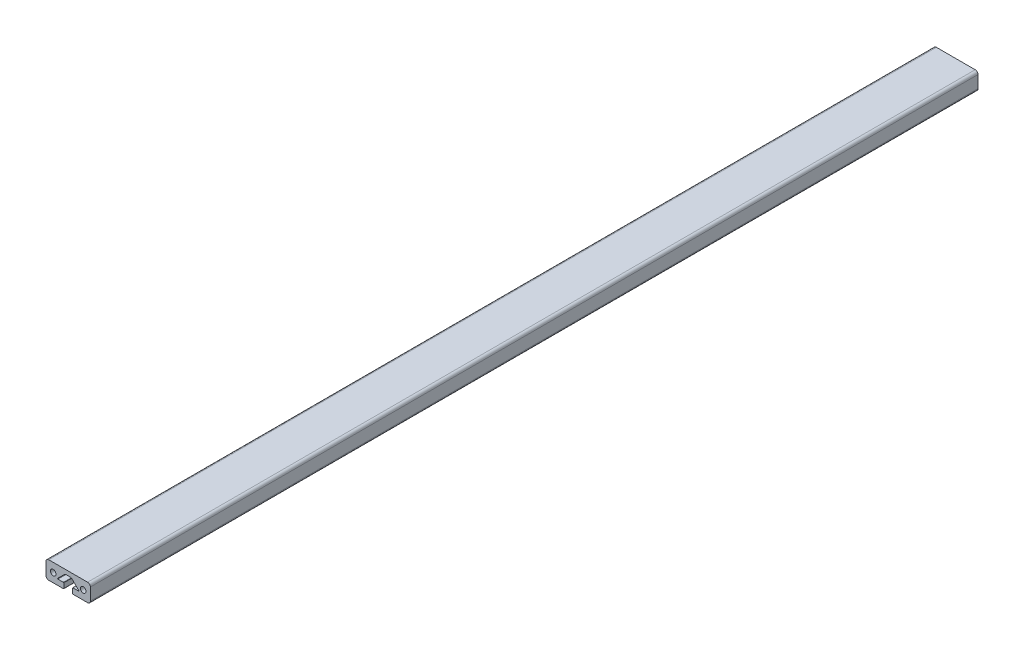
ISO-10303-21;
HEADER;
FILE_DESCRIPTION(('STEP AP214'),'2;1');
FILE_NAME('part.step','',(''),(''),'','','');
FILE_SCHEMA(('AUTOMOTIVE_DESIGN { 1 0 10303 214 1 1 1 1 }'));
ENDSEC;
DATA;
#1=APPLICATION_CONTEXT('core data for automotive mechanical design processes');
#2=APPLICATION_PROTOCOL_DEFINITION('international standard','automotive_design',2000,#1);
#3=PRODUCT_CONTEXT('',#1,'mechanical');
#4=PRODUCT('Part','Part','',(#3));
#5=PRODUCT_RELATED_PRODUCT_CATEGORY('part','',(#4));
#6=PRODUCT_DEFINITION_FORMATION('','',#4);
#7=PRODUCT_DEFINITION_CONTEXT('part definition',#1,'design');
#8=PRODUCT_DEFINITION('design','',#6,#7);
#9=PRODUCT_DEFINITION_SHAPE('','',#8);
#10=(LENGTH_UNIT() NAMED_UNIT(*) SI_UNIT(.MILLI.,.METRE.));
#11=(NAMED_UNIT(*) PLANE_ANGLE_UNIT() SI_UNIT($,.RADIAN.));
#12=(NAMED_UNIT(*) SI_UNIT($,.STERADIAN.) SOLID_ANGLE_UNIT());
#13=UNCERTAINTY_MEASURE_WITH_UNIT(LENGTH_MEASURE(1.E-05),#10,'distance_accuracy_value','');
#14=(GEOMETRIC_REPRESENTATION_CONTEXT(3) GLOBAL_UNCERTAINTY_ASSIGNED_CONTEXT((#13)) GLOBAL_UNIT_ASSIGNED_CONTEXT((#10,
#11,#12)) REPRESENTATION_CONTEXT('',''));
#15=CARTESIAN_POINT('',(0.,0.,0.));
#16=DIRECTION('',(0.,0.,1.));
#17=DIRECTION('',(1.,0.,0.));
#18=AXIS2_PLACEMENT_3D('',#15,#16,#17);
#19=CARTESIAN_POINT('',(-1.09175820488421,1.74579242636731,800.));
#20=DIRECTION('',(0.,0.,1.));
#21=DIRECTION('',(1.,0.,0.));
#22=AXIS2_PLACEMENT_3D('',#19,#20,#21);
#23=PLANE('',#22);
#24=CARTESIAN_POINT('',(-12.6201853296306,-0.45420757363257,800.));
#25=DIRECTION('',(0.,0.,1.));
#26=DIRECTION('',(1.,0.,0.));
#27=AXIS2_PLACEMENT_3D('',#24,#25,#26);
#28=CIRCLE('',#27,2.49999999999995);
#29=CARTESIAN_POINT('',(-10.1201853296307,-0.45420757363257,800.));
#30=VERTEX_POINT('',#29);
#31=EDGE_CURVE('E228',#30,#30,#28,.T.);
#32=ORIENTED_EDGE('',*,*,#31,.F.);
#33=EDGE_LOOP('',(#32));
#34=FACE_BOUND('',#33,.T.);
#35=CARTESIAN_POINT('',(-1.09175820488421,1.74579242636731,800.));
#36=DIRECTION('',(0.,0.,-1.));
#37=DIRECTION('',(1.,0.,0.));
#38=AXIS2_PLACEMENT_3D('',#35,#36,#37);
#39=CIRCLE('',#38,1.99999999999981);
#40=CARTESIAN_POINT('',(-2.50597176725728,3.16000598874015,800.));
#41=VERTEX_POINT('',#40);
#42=CARTESIAN_POINT('',(-1.09175820488421,3.74579242636711,800.));
#43=VERTEX_POINT('',#42);
#44=EDGE_CURVE('E271',#41,#43,#39,.T.);
#45=ORIENTED_EDGE('',*,*,#44,.T.);
#46=DIRECTION('',(1.,0.,0.));
#47=VECTOR('',#46,1.);
#48=CARTESIAN_POINT('',(-1.09175820488421,3.74579242636711,800.));
#49=LINE('',#48,#47);
#50=CARTESIAN_POINT('',(2.8513875456237,3.74579242636711,800.));
#51=VERTEX_POINT('',#50);
#52=EDGE_CURVE('E139',#43,#51,#49,.T.);
#53=ORIENTED_EDGE('',*,*,#52,.T.);
#54=CARTESIAN_POINT('',(2.85138754562348,1.7457924263674,800.));
#55=DIRECTION('',(0.,0.,-1.));
#56=DIRECTION('',(1.,0.,0.));
#57=AXIS2_PLACEMENT_3D('',#54,#55,#56);
#58=CIRCLE('',#57,1.99999999999971);
#59=CARTESIAN_POINT('',(4.26560110799648,3.16000598874018,800.));
#60=VERTEX_POINT('',#59);
#61=EDGE_CURVE('E334',#51,#60,#58,.T.);
#62=ORIENTED_EDGE('',*,*,#61,.T.);
#63=DIRECTION('',(0.707106781186548,-0.707106781186548,0.));
#64=VECTOR('',#63,1.);
#65=CARTESIAN_POINT('',(4.26560110799648,3.16000598874018,800.));
#66=LINE('',#65,#64);
#67=CARTESIAN_POINT('',(10.3676826360141,-2.94207553927743,800.));
#68=VERTEX_POINT('',#67);
#69=EDGE_CURVE('E353',#60,#68,#66,.T.);
#70=ORIENTED_EDGE('',*,*,#69,.T.);
#71=CARTESIAN_POINT('',(10.1555506016582,-3.15420757363334,800.));
#72=DIRECTION('',(0.,0.,-1.));
#73=DIRECTION('',(1.,0.,0.));
#74=AXIS2_PLACEMENT_3D('',#71,#72,#73);
#75=CIRCLE('',#74,0.299999999999926);
#76=CARTESIAN_POINT('',(10.1555506016583,-3.45420757363327,800.));
#77=VERTEX_POINT('',#76);
#78=EDGE_CURVE('E350',#68,#77,#75,.T.);
#79=ORIENTED_EDGE('',*,*,#78,.T.);
#80=DIRECTION('',(-1.,0.,0.));
#81=VECTOR('',#80,1.);
#82=CARTESIAN_POINT('',(10.1555506016583,-3.45420757363327,800.));
#83=LINE('',#82,#81);
#84=CARTESIAN_POINT('',(5.17981467036988,-3.45420757363327,800.));
#85=VERTEX_POINT('',#84);
#86=EDGE_CURVE('E352',#77,#85,#83,.T.);
#87=ORIENTED_EDGE('',*,*,#86,.T.);
#88=CARTESIAN_POINT('',(5.17981467036977,-3.75420757363335,800.));
#89=DIRECTION('',(0.,0.,1.));
#90=DIRECTION('',(1.,0.,0.));
#91=AXIS2_PLACEMENT_3D('',#88,#89,#90);
#92=CIRCLE('',#91,0.300000000000078);
#93=CARTESIAN_POINT('',(4.87981467036969,-3.75420757363323,800.));
#94=VERTEX_POINT('',#93);
#95=EDGE_CURVE('E355',#85,#94,#92,.T.);
#96=ORIENTED_EDGE('',*,*,#95,.T.);
#97=DIRECTION('',(0.,-1.,0.));
#98=VECTOR('',#97,1.);
#99=CARTESIAN_POINT('',(4.87981467036969,-3.75420757363323,800.));
#100=LINE('',#99,#98);
#101=CARTESIAN_POINT('',(4.87981467036969,-8.1542075736333,800.));
#102=VERTEX_POINT('',#101);
#103=EDGE_CURVE('E361',#94,#102,#100,.T.);
#104=ORIENTED_EDGE('',*,*,#103,.T.);
#105=CARTESIAN_POINT('',(5.17981467036977,-8.15420757363319,800.));
#106=DIRECTION('',(0.,0.,1.));
#107=DIRECTION('',(1.,0.,0.));
#108=AXIS2_PLACEMENT_3D('',#105,#106,#107);
#109=CIRCLE('',#108,0.300000000000078);
#110=CARTESIAN_POINT('',(5.17981467036988,-8.45420757363327,800.));
#111=VERTEX_POINT('',#110);
#112=EDGE_CURVE('E363',#102,#111,#109,.T.);
#113=ORIENTED_EDGE('',*,*,#112,.T.);
#114=DIRECTION('',(1.,0.,0.));
#115=VECTOR('',#114,1.);
#116=CARTESIAN_POINT('',(5.17981467036988,-8.45420757363327,800.));
#117=LINE('',#116,#115);
#118=CARTESIAN_POINT('',(18.3798146703701,-8.45420757363327,800.));
#119=VERTEX_POINT('',#118);
#120=EDGE_CURVE('E365',#111,#119,#117,.T.);
#121=ORIENTED_EDGE('',*,*,#120,.T.);
#122=CARTESIAN_POINT('',(18.3798146703701,-5.95420757363321,800.));
#123=DIRECTION('',(0.,0.,1.));
#124=DIRECTION('',(1.,0.,0.));
#125=AXIS2_PLACEMENT_3D('',#122,#123,#124);
#126=CIRCLE('',#125,2.50000000000006);
#127=CARTESIAN_POINT('',(20.8798146703701,-5.95420757363332,800.));
#128=VERTEX_POINT('',#127);
#129=EDGE_CURVE('E367',#119,#128,#126,.T.);
#130=ORIENTED_EDGE('',*,*,#129,.T.);
#131=DIRECTION('',(0.,1.,0.));
#132=VECTOR('',#131,1.);
#133=CARTESIAN_POINT('',(20.8798146703701,-5.95420757363332,800.));
#134=LINE('',#133,#132);
#135=CARTESIAN_POINT('',(20.8798146703701,5.04579242636669,800.));
#136=VERTEX_POINT('',#135);
#137=EDGE_CURVE('E369',#128,#136,#134,.T.);
#138=ORIENTED_EDGE('',*,*,#137,.T.);
#139=CARTESIAN_POINT('',(18.3798146703701,5.04579242636735,800.));
#140=DIRECTION('',(0.,0.,1.));
#141=DIRECTION('',(1.,0.,0.));
#142=AXIS2_PLACEMENT_3D('',#139,#140,#141);
#143=CIRCLE('',#142,2.50000000000009);
#144=CARTESIAN_POINT('',(18.3798146703694,7.54579242636744,800.));
#145=VERTEX_POINT('',#144);
#146=EDGE_CURVE('E371',#136,#145,#143,.T.);
#147=ORIENTED_EDGE('',*,*,#146,.T.);
#148=DIRECTION('',(-1.,0.,0.));
#149=VECTOR('',#148,1.);
#150=CARTESIAN_POINT('',(18.3798146703694,7.54579242636744,800.));
#151=LINE('',#150,#149);
#152=CARTESIAN_POINT('',(-16.6201853296301,7.54579242636744,800.));
#153=VERTEX_POINT('',#152);
#154=EDGE_CURVE('E373',#145,#153,#151,.T.);
#155=ORIENTED_EDGE('',*,*,#154,.T.);
#156=CARTESIAN_POINT('',(-16.6201853296299,5.04579242636727,800.));
#157=DIRECTION('',(0.,0.,1.));
#158=DIRECTION('',(1.,0.,0.));
#159=AXIS2_PLACEMENT_3D('',#156,#157,#158);
#160=CIRCLE('',#159,2.50000000000017);
#161=CARTESIAN_POINT('',(-19.1201853296301,5.04579242636738,800.));
#162=VERTEX_POINT('',#161);
#163=EDGE_CURVE('E375',#153,#162,#160,.T.);
#164=ORIENTED_EDGE('',*,*,#163,.T.);
#165=DIRECTION('',(0.,-1.,0.));
#166=VECTOR('',#165,1.);
#167=CARTESIAN_POINT('',(-19.1201853296301,5.04579242636738,800.));
#168=LINE('',#167,#166);
#169=CARTESIAN_POINT('',(-19.1201853296301,-5.95420757363263,800.));
#170=VERTEX_POINT('',#169);
#171=EDGE_CURVE('E377',#162,#170,#168,.T.);
#172=ORIENTED_EDGE('',*,*,#171,.T.);
#173=CARTESIAN_POINT('',(-16.6201853296302,-5.95420757363263,800.));
#174=DIRECTION('',(0.,0.,1.));
#175=DIRECTION('',(1.,0.,0.));
#176=AXIS2_PLACEMENT_3D('',#173,#174,#175);
#177=CIRCLE('',#176,2.49999999999995);
#178=CARTESIAN_POINT('',(-16.6201853296302,-8.45420757363258,800.));
#179=VERTEX_POINT('',#178);
#180=EDGE_CURVE('E379',#170,#179,#177,.T.);
#181=ORIENTED_EDGE('',*,*,#180,.T.);
#182=DIRECTION('',(1.,0.,0.));
#183=VECTOR('',#182,1.);
#184=CARTESIAN_POINT('',(-16.6201853296302,-8.45420757363258,800.));
#185=LINE('',#184,#183);
#186=CARTESIAN_POINT('',(-3.42018532963029,-8.45420757363258,800.));
#187=VERTEX_POINT('',#186);
#188=EDGE_CURVE('E381',#179,#187,#185,.T.);
#189=ORIENTED_EDGE('',*,*,#188,.T.);
#190=CARTESIAN_POINT('',(-3.42018532963018,-8.1542075736325,800.));
#191=DIRECTION('',(0.,0.,1.));
#192=DIRECTION('',(1.,0.,0.));
#193=AXIS2_PLACEMENT_3D('',#190,#191,#192);
#194=CIRCLE('',#193,0.300000000000078);
#195=CARTESIAN_POINT('',(-3.1201853296301,-8.15420757363261,800.));
#196=VERTEX_POINT('',#195);
#197=EDGE_CURVE('E383',#187,#196,#194,.T.);
#198=ORIENTED_EDGE('',*,*,#197,.T.);
#199=DIRECTION('',(0.,1.,0.));
#200=VECTOR('',#199,1.);
#201=CARTESIAN_POINT('',(-3.1201853296301,-8.15420757363261,800.));
#202=LINE('',#201,#200);
#203=CARTESIAN_POINT('',(-3.1201853296301,-3.75420757363254,800.));
#204=VERTEX_POINT('',#203);
#205=EDGE_CURVE('E385',#196,#204,#202,.T.);
#206=ORIENTED_EDGE('',*,*,#205,.T.);
#207=CARTESIAN_POINT('',(-3.42018532963018,-3.75420757363254,800.));
#208=DIRECTION('',(0.,0.,1.));
#209=DIRECTION('',(1.,0.,0.));
#210=AXIS2_PLACEMENT_3D('',#207,#208,#209);
#211=CIRCLE('',#210,0.300000000000078);
#212=CARTESIAN_POINT('',(-3.42018532963018,-3.45420757363246,800.));
#213=VERTEX_POINT('',#212);
#214=EDGE_CURVE('E206',#204,#213,#211,.T.);
#215=ORIENTED_EDGE('',*,*,#214,.T.);
#216=DIRECTION('',(-1.,0.,0.));
#217=VECTOR('',#216,1.);
#218=CARTESIAN_POINT('',(-8.39592126091815,-3.45420757363246,800.));
#219=LINE('',#218,#217);
#220=CARTESIAN_POINT('',(-8.39592126091815,-3.45420757363246,800.));
#221=VERTEX_POINT('',#220);
#222=EDGE_CURVE('E200',#213,#221,#219,.T.);
#223=ORIENTED_EDGE('',*,*,#222,.T.);
#224=CARTESIAN_POINT('',(-8.39592126091815,-3.15420757363254,800.));
#225=DIRECTION('',(0.,0.,-1.));
#226=DIRECTION('',(1.,0.,0.));
#227=AXIS2_PLACEMENT_3D('',#224,#225,#226);
#228=CIRCLE('',#227,0.299999999999926);
#229=CARTESIAN_POINT('',(-8.60805329527406,-2.94207553927662,800.));
#230=VERTEX_POINT('',#229);
#231=EDGE_CURVE('E204',#221,#230,#228,.T.);
#232=ORIENTED_EDGE('',*,*,#231,.T.);
#233=DIRECTION('',(0.707106781186548,0.707106781186548,0.));
#234=VECTOR('',#233,1.);
#235=CARTESIAN_POINT('',(-8.60805329527406,-2.94207553927662,800.));
#236=LINE('',#235,#234);
#237=EDGE_CURVE('E48',#230,#41,#236,.T.);
#238=ORIENTED_EDGE('',*,*,#237,.T.);
#239=EDGE_LOOP('',(#45,#53,#62,#70,#79,#87,#96,#104,#113,#121,#130,#138,#147,#155,#164,#172,
#181,#189,#198,#206,#215,#223,#232,#238));
#240=FACE_BOUND('',#239,.T.);
#241=CARTESIAN_POINT('',(14.3798146703694,-0.45420757363257,800.));
#242=DIRECTION('',(0.,0.,1.));
#243=DIRECTION('',(1.,0.,0.));
#244=AXIS2_PLACEMENT_3D('',#241,#242,#243);
#245=CIRCLE('',#244,2.49999999999995);
#246=CARTESIAN_POINT('',(16.8798146703694,-0.45420757363257,800.));
#247=VERTEX_POINT('',#246);
#248=EDGE_CURVE('E428',#247,#247,#245,.T.);
#249=ORIENTED_EDGE('',*,*,#248,.F.);
#250=EDGE_LOOP('',(#249));
#251=FACE_BOUND('',#250,.T.);
#252=ADVANCED_FACE('F31',(#34,#240,#251),#23,.T.);
#253=CARTESIAN_POINT('',(-1.09175820488421,1.74579242636731,0.));
#254=DIRECTION('',(0.,0.,1.));
#255=DIRECTION('',(1.,0.,0.));
#256=AXIS2_PLACEMENT_3D('',#253,#254,#255);
#257=PLANE('',#256);
#258=CARTESIAN_POINT('',(-12.6201853296306,-0.45420757363257,0.));
#259=DIRECTION('',(0.,0.,1.));
#260=DIRECTION('',(1.,0.,0.));
#261=AXIS2_PLACEMENT_3D('',#258,#259,#260);
#262=CIRCLE('',#261,2.49999999999995);
#263=CARTESIAN_POINT('',(-10.1201853296307,-0.45420757363257,0.));
#264=VERTEX_POINT('',#263);
#265=EDGE_CURVE('E433',#264,#264,#262,.T.);
#266=ORIENTED_EDGE('',*,*,#265,.T.);
#267=EDGE_LOOP('',(#266));
#268=FACE_BOUND('',#267,.T.);
#269=CARTESIAN_POINT('',(-1.09175820488421,1.74579242636731,0.));
#270=DIRECTION('',(0.,0.,-1.));
#271=DIRECTION('',(1.,0.,0.));
#272=AXIS2_PLACEMENT_3D('',#269,#270,#271);
#273=CIRCLE('',#272,1.99999999999981);
#274=CARTESIAN_POINT('',(-2.50597176725728,3.16000598874015,0.));
#275=VERTEX_POINT('',#274);
#276=CARTESIAN_POINT('',(-1.09175820488421,3.74579242636711,0.));
#277=VERTEX_POINT('',#276);
#278=EDGE_CURVE('E224',#275,#277,#273,.T.);
#279=ORIENTED_EDGE('',*,*,#278,.F.);
#280=DIRECTION('',(0.707106781186548,0.707106781186548,0.));
#281=VECTOR('',#280,1.);
#282=CARTESIAN_POINT('',(-8.60805329527406,-2.94207553927662,0.));
#283=LINE('',#282,#281);
#284=CARTESIAN_POINT('',(-8.60805329527406,-2.94207553927662,0.));
#285=VERTEX_POINT('',#284);
#286=EDGE_CURVE('E131',#285,#275,#283,.T.);
#287=ORIENTED_EDGE('',*,*,#286,.F.);
#288=CARTESIAN_POINT('',(-8.39592126091815,-3.15420757363254,0.));
#289=DIRECTION('',(0.,0.,-1.));
#290=DIRECTION('',(1.,0.,0.));
#291=AXIS2_PLACEMENT_3D('',#288,#289,#290);
#292=CIRCLE('',#291,0.299999999999926);
#293=CARTESIAN_POINT('',(-8.39592126091815,-3.45420757363246,0.));
#294=VERTEX_POINT('',#293);
#295=EDGE_CURVE('E125',#294,#285,#292,.T.);
#296=ORIENTED_EDGE('',*,*,#295,.F.);
#297=DIRECTION('',(-1.,0.,0.));
#298=VECTOR('',#297,1.);
#299=CARTESIAN_POINT('',(-8.39592126091815,-3.45420757363246,0.));
#300=LINE('',#299,#298);
#301=CARTESIAN_POINT('',(-3.42018532963018,-3.45420757363246,0.));
#302=VERTEX_POINT('',#301);
#303=EDGE_CURVE('E214',#302,#294,#300,.T.);
#304=ORIENTED_EDGE('',*,*,#303,.F.);
#305=CARTESIAN_POINT('',(-3.42018532963018,-3.75420757363254,0.));
#306=DIRECTION('',(0.,0.,1.));
#307=DIRECTION('',(1.,0.,0.));
#308=AXIS2_PLACEMENT_3D('',#305,#306,#307);
#309=CIRCLE('',#308,0.300000000000078);
#310=CARTESIAN_POINT('',(-3.1201853296301,-3.75420757363254,0.));
#311=VERTEX_POINT('',#310);
#312=EDGE_CURVE('E266',#311,#302,#309,.T.);
#313=ORIENTED_EDGE('',*,*,#312,.F.);
#314=DIRECTION('',(0.,1.,0.));
#315=VECTOR('',#314,1.);
#316=CARTESIAN_POINT('',(-3.1201853296301,-8.15420757363261,0.));
#317=LINE('',#316,#315);
#318=CARTESIAN_POINT('',(-3.1201853296301,-8.15420757363261,0.));
#319=VERTEX_POINT('',#318);
#320=EDGE_CURVE('E264',#319,#311,#317,.T.);
#321=ORIENTED_EDGE('',*,*,#320,.F.);
#322=CARTESIAN_POINT('',(-3.42018532963018,-8.1542075736325,0.));
#323=DIRECTION('',(0.,0.,1.));
#324=DIRECTION('',(1.,0.,0.));
#325=AXIS2_PLACEMENT_3D('',#322,#323,#324);
#326=CIRCLE('',#325,0.300000000000078);
#327=CARTESIAN_POINT('',(-3.42018532963029,-8.45420757363258,0.));
#328=VERTEX_POINT('',#327);
#329=EDGE_CURVE('E262',#328,#319,#326,.T.);
#330=ORIENTED_EDGE('',*,*,#329,.F.);
#331=DIRECTION('',(1.,0.,0.));
#332=VECTOR('',#331,1.);
#333=CARTESIAN_POINT('',(-16.6201853296302,-8.45420757363258,0.));
#334=LINE('',#333,#332);
#335=CARTESIAN_POINT('',(-16.6201853296302,-8.45420757363258,0.));
#336=VERTEX_POINT('',#335);
#337=EDGE_CURVE('E260',#336,#328,#334,.T.);
#338=ORIENTED_EDGE('',*,*,#337,.F.);
#339=CARTESIAN_POINT('',(-16.6201853296302,-5.95420757363263,0.));
#340=DIRECTION('',(0.,0.,1.));
#341=DIRECTION('',(1.,0.,0.));
#342=AXIS2_PLACEMENT_3D('',#339,#340,#341);
#343=CIRCLE('',#342,2.49999999999995);
#344=CARTESIAN_POINT('',(-19.1201853296301,-5.95420757363263,0.));
#345=VERTEX_POINT('',#344);
#346=EDGE_CURVE('E258',#345,#336,#343,.T.);
#347=ORIENTED_EDGE('',*,*,#346,.F.);
#348=DIRECTION('',(0.,-1.,0.));
#349=VECTOR('',#348,1.);
#350=CARTESIAN_POINT('',(-19.1201853296301,5.04579242636738,0.));
#351=LINE('',#350,#349);
#352=CARTESIAN_POINT('',(-19.1201853296301,5.04579242636738,0.));
#353=VERTEX_POINT('',#352);
#354=EDGE_CURVE('E256',#353,#345,#351,.T.);
#355=ORIENTED_EDGE('',*,*,#354,.F.);
#356=CARTESIAN_POINT('',(-16.6201853296299,5.04579242636727,0.));
#357=DIRECTION('',(0.,0.,1.));
#358=DIRECTION('',(1.,0.,0.));
#359=AXIS2_PLACEMENT_3D('',#356,#357,#358);
#360=CIRCLE('',#359,2.50000000000017);
#361=CARTESIAN_POINT('',(-16.6201853296301,7.54579242636744,0.));
#362=VERTEX_POINT('',#361);
#363=EDGE_CURVE('E254',#362,#353,#360,.T.);
#364=ORIENTED_EDGE('',*,*,#363,.F.);
#365=DIRECTION('',(-1.,0.,0.));
#366=VECTOR('',#365,1.);
#367=CARTESIAN_POINT('',(18.3798146703694,7.54579242636744,0.));
#368=LINE('',#367,#366);
#369=CARTESIAN_POINT('',(18.3798146703694,7.54579242636744,0.));
#370=VERTEX_POINT('',#369);
#371=EDGE_CURVE('E252',#370,#362,#368,.T.);
#372=ORIENTED_EDGE('',*,*,#371,.F.);
#373=CARTESIAN_POINT('',(18.3798146703701,5.04579242636735,0.));
#374=DIRECTION('',(0.,0.,1.));
#375=DIRECTION('',(1.,0.,0.));
#376=AXIS2_PLACEMENT_3D('',#373,#374,#375);
#377=CIRCLE('',#376,2.50000000000009);
#378=CARTESIAN_POINT('',(20.8798146703701,5.04579242636669,0.));
#379=VERTEX_POINT('',#378);
#380=EDGE_CURVE('E250',#379,#370,#377,.T.);
#381=ORIENTED_EDGE('',*,*,#380,.F.);
#382=DIRECTION('',(0.,1.,0.));
#383=VECTOR('',#382,1.);
#384=CARTESIAN_POINT('',(20.8798146703701,-5.95420757363332,0.));
#385=LINE('',#384,#383);
#386=CARTESIAN_POINT('',(20.8798146703701,-5.95420757363332,0.));
#387=VERTEX_POINT('',#386);
#388=EDGE_CURVE('E248',#387,#379,#385,.T.);
#389=ORIENTED_EDGE('',*,*,#388,.F.);
#390=CARTESIAN_POINT('',(18.3798146703701,-5.95420757363321,0.));
#391=DIRECTION('',(0.,0.,1.));
#392=DIRECTION('',(1.,0.,0.));
#393=AXIS2_PLACEMENT_3D('',#390,#391,#392);
#394=CIRCLE('',#393,2.50000000000006);
#395=CARTESIAN_POINT('',(18.3798146703701,-8.45420757363327,0.));
#396=VERTEX_POINT('',#395);
#397=EDGE_CURVE('E246',#396,#387,#394,.T.);
#398=ORIENTED_EDGE('',*,*,#397,.F.);
#399=DIRECTION('',(1.,0.,0.));
#400=VECTOR('',#399,1.);
#401=CARTESIAN_POINT('',(5.17981467036988,-8.45420757363327,0.));
#402=LINE('',#401,#400);
#403=CARTESIAN_POINT('',(5.17981467036988,-8.45420757363327,0.));
#404=VERTEX_POINT('',#403);
#405=EDGE_CURVE('E244',#404,#396,#402,.T.);
#406=ORIENTED_EDGE('',*,*,#405,.F.);
#407=CARTESIAN_POINT('',(5.17981467036977,-8.15420757363319,0.));
#408=DIRECTION('',(0.,0.,1.));
#409=DIRECTION('',(1.,0.,0.));
#410=AXIS2_PLACEMENT_3D('',#407,#408,#409);
#411=CIRCLE('',#410,0.300000000000078);
#412=CARTESIAN_POINT('',(4.87981467036969,-8.1542075736333,0.));
#413=VERTEX_POINT('',#412);
#414=EDGE_CURVE('E242',#413,#404,#411,.T.);
#415=ORIENTED_EDGE('',*,*,#414,.F.);
#416=DIRECTION('',(0.,-1.,0.));
#417=VECTOR('',#416,1.);
#418=CARTESIAN_POINT('',(4.87981467036969,-3.75420757363323,0.));
#419=LINE('',#418,#417);
#420=CARTESIAN_POINT('',(4.87981467036969,-3.75420757363323,0.));
#421=VERTEX_POINT('',#420);
#422=EDGE_CURVE('E240',#421,#413,#419,.T.);
#423=ORIENTED_EDGE('',*,*,#422,.F.);
#424=CARTESIAN_POINT('',(5.17981467036977,-3.75420757363335,0.));
#425=DIRECTION('',(0.,0.,1.));
#426=DIRECTION('',(1.,0.,0.));
#427=AXIS2_PLACEMENT_3D('',#424,#425,#426);
#428=CIRCLE('',#427,0.300000000000078);
#429=CARTESIAN_POINT('',(5.17981467036988,-3.45420757363327,0.));
#430=VERTEX_POINT('',#429);
#431=EDGE_CURVE('E238',#430,#421,#428,.T.);
#432=ORIENTED_EDGE('',*,*,#431,.F.);
#433=DIRECTION('',(-1.,0.,0.));
#434=VECTOR('',#433,1.);
#435=CARTESIAN_POINT('',(10.1555506016583,-3.45420757363327,0.));
#436=LINE('',#435,#434);
#437=CARTESIAN_POINT('',(10.1555506016583,-3.45420757363327,0.));
#438=VERTEX_POINT('',#437);
#439=EDGE_CURVE('E236',#438,#430,#436,.T.);
#440=ORIENTED_EDGE('',*,*,#439,.F.);
#441=CARTESIAN_POINT('',(10.1555506016582,-3.15420757363334,0.));
#442=DIRECTION('',(0.,0.,-1.));
#443=DIRECTION('',(1.,0.,0.));
#444=AXIS2_PLACEMENT_3D('',#441,#442,#443);
#445=CIRCLE('',#444,0.299999999999926);
#446=CARTESIAN_POINT('',(10.3676826360141,-2.94207553927743,0.));
#447=VERTEX_POINT('',#446);
#448=EDGE_CURVE('E234',#447,#438,#445,.T.);
#449=ORIENTED_EDGE('',*,*,#448,.F.);
#450=DIRECTION('',(0.707106781186548,-0.707106781186548,0.));
#451=VECTOR('',#450,1.);
#452=CARTESIAN_POINT('',(4.26560110799648,3.16000598874018,0.));
#453=LINE('',#452,#451);
#454=CARTESIAN_POINT('',(4.26560110799648,3.16000598874018,0.));
#455=VERTEX_POINT('',#454);
#456=EDGE_CURVE('E232',#455,#447,#453,.T.);
#457=ORIENTED_EDGE('',*,*,#456,.F.);
#458=CARTESIAN_POINT('',(2.85138754562348,1.7457924263674,0.));
#459=DIRECTION('',(0.,0.,-1.));
#460=DIRECTION('',(1.,0.,0.));
#461=AXIS2_PLACEMENT_3D('',#458,#459,#460);
#462=CIRCLE('',#461,1.99999999999971);
#463=CARTESIAN_POINT('',(2.8513875456237,3.74579242636711,0.));
#464=VERTEX_POINT('',#463);
#465=EDGE_CURVE('E230',#464,#455,#462,.T.);
#466=ORIENTED_EDGE('',*,*,#465,.F.);
#467=DIRECTION('',(1.,0.,0.));
#468=VECTOR('',#467,1.);
#469=CARTESIAN_POINT('',(-1.09175820488421,3.74579242636711,0.));
#470=LINE('',#469,#468);
#471=EDGE_CURVE('E227',#277,#464,#470,.T.);
#472=ORIENTED_EDGE('',*,*,#471,.F.);
#473=EDGE_LOOP('',(#279,#287,#296,#304,#313,#321,#330,#338,#347,#355,#364,#372,#381,#389,#398,
#406,#415,#423,#432,#440,#449,#457,#466,#472));
#474=FACE_BOUND('',#473,.T.);
#475=CARTESIAN_POINT('',(14.3798146703694,-0.45420757363257,0.));
#476=DIRECTION('',(0.,0.,1.));
#477=DIRECTION('',(1.,0.,0.));
#478=AXIS2_PLACEMENT_3D('',#475,#476,#477);
#479=CIRCLE('',#478,2.49999999999995);
#480=CARTESIAN_POINT('',(16.8798146703694,-0.45420757363257,0.));
#481=VERTEX_POINT('',#480);
#482=EDGE_CURVE('E431',#481,#481,#479,.T.);
#483=ORIENTED_EDGE('',*,*,#482,.T.);
#484=EDGE_LOOP('',(#483));
#485=FACE_BOUND('',#484,.T.);
#486=ADVANCED_FACE('F338',(#268,#474,#485),#257,.F.);
#487=CARTESIAN_POINT('',(-1.09175820488421,1.74579242636731,800.));
#488=DIRECTION('',(0.,0.,-1.));
#489=DIRECTION('',(-1.,0.,0.));
#490=AXIS2_PLACEMENT_3D('',#487,#488,#489);
#491=CYLINDRICAL_SURFACE('',#490,1.99999999999981);
#492=ORIENTED_EDGE('',*,*,#278,.T.);
#493=DIRECTION('',(0.,0.,-1.));
#494=VECTOR('',#493,1.);
#495=CARTESIAN_POINT('',(-1.09175820488421,3.74579242636711,800.));
#496=LINE('',#495,#494);
#497=EDGE_CURVE('E11',#43,#277,#496,.T.);
#498=ORIENTED_EDGE('',*,*,#497,.F.);
#499=ORIENTED_EDGE('',*,*,#44,.F.);
#500=DIRECTION('',(0.,0.,-1.));
#501=VECTOR('',#500,1.);
#502=CARTESIAN_POINT('',(-2.50597176725728,3.16000598874015,800.));
#503=LINE('',#502,#501);
#504=EDGE_CURVE('E220',#41,#275,#503,.T.);
#505=ORIENTED_EDGE('',*,*,#504,.T.);
#506=EDGE_LOOP('',(#492,#498,#499,#505));
#507=FACE_BOUND('',#506,.T.);
#508=ADVANCED_FACE('F33',(#507),#491,.F.);
#509=CARTESIAN_POINT('',(-1.09175820488421,3.74579242636711,800.));
#510=DIRECTION('',(0.,1.,0.));
#511=DIRECTION('',(0.,0.,1.));
#512=AXIS2_PLACEMENT_3D('',#509,#510,#511);
#513=PLANE('',#512);
#514=ORIENTED_EDGE('',*,*,#471,.T.);
#515=DIRECTION('',(0.,0.,-1.));
#516=VECTOR('',#515,1.);
#517=CARTESIAN_POINT('',(2.8513875456237,3.74579242636711,800.));
#518=LINE('',#517,#516);
#519=EDGE_CURVE('E40',#51,#464,#518,.T.);
#520=ORIENTED_EDGE('',*,*,#519,.F.);
#521=ORIENTED_EDGE('',*,*,#52,.F.);
#522=ORIENTED_EDGE('',*,*,#497,.T.);
#523=EDGE_LOOP('',(#514,#520,#521,#522));
#524=FACE_BOUND('',#523,.T.);
#525=ADVANCED_FACE('F646',(#524),#513,.F.);
#526=CARTESIAN_POINT('',(2.85138754562348,1.7457924263674,800.));
#527=DIRECTION('',(0.,0.,-1.));
#528=DIRECTION('',(-1.,0.,0.));
#529=AXIS2_PLACEMENT_3D('',#526,#527,#528);
#530=CYLINDRICAL_SURFACE('',#529,1.99999999999971);
#531=ORIENTED_EDGE('',*,*,#465,.T.);
#532=DIRECTION('',(0.,0.,-1.));
#533=VECTOR('',#532,1.);
#534=CARTESIAN_POINT('',(4.26560110799648,3.16000598874018,800.));
#535=LINE('',#534,#533);
#536=EDGE_CURVE('E326',#60,#455,#535,.T.);
#537=ORIENTED_EDGE('',*,*,#536,.F.);
#538=ORIENTED_EDGE('',*,*,#61,.F.);
#539=ORIENTED_EDGE('',*,*,#519,.T.);
#540=EDGE_LOOP('',(#531,#537,#538,#539));
#541=FACE_BOUND('',#540,.T.);
#542=ADVANCED_FACE('F332',(#541),#530,.F.);
#543=CARTESIAN_POINT('',(4.26560110799648,3.16000598874018,800.));
#544=DIRECTION('',(0.707106781186548,0.707106781186548,0.));
#545=DIRECTION('',(-0.707106781186548,0.707106781186548,0.));
#546=AXIS2_PLACEMENT_3D('',#543,#544,#545);
#547=PLANE('',#546);
#548=ORIENTED_EDGE('',*,*,#456,.T.);
#549=DIRECTION('',(0.,0.,-1.));
#550=VECTOR('',#549,1.);
#551=CARTESIAN_POINT('',(10.3676826360141,-2.94207553927743,800.));
#552=LINE('',#551,#550);
#553=EDGE_CURVE('E323',#68,#447,#552,.T.);
#554=ORIENTED_EDGE('',*,*,#553,.F.);
#555=ORIENTED_EDGE('',*,*,#69,.F.);
#556=ORIENTED_EDGE('',*,*,#536,.T.);
#557=EDGE_LOOP('',(#548,#554,#555,#556));
#558=FACE_BOUND('',#557,.T.);
#559=ADVANCED_FACE('F344',(#558),#547,.F.);
#560=CARTESIAN_POINT('',(10.1555506016582,-3.15420757363334,800.));
#561=DIRECTION('',(0.,0.,-1.));
#562=DIRECTION('',(-1.,0.,0.));
#563=AXIS2_PLACEMENT_3D('',#560,#561,#562);
#564=CYLINDRICAL_SURFACE('',#563,0.299999999999926);
#565=ORIENTED_EDGE('',*,*,#448,.T.);
#566=DIRECTION('',(0.,0.,-1.));
#567=VECTOR('',#566,1.);
#568=CARTESIAN_POINT('',(10.1555506016583,-3.45420757363327,800.));
#569=LINE('',#568,#567);
#570=EDGE_CURVE('E320',#77,#438,#569,.T.);
#571=ORIENTED_EDGE('',*,*,#570,.F.);
#572=ORIENTED_EDGE('',*,*,#78,.F.);
#573=ORIENTED_EDGE('',*,*,#553,.T.);
#574=EDGE_LOOP('',(#565,#571,#572,#573));
#575=FACE_BOUND('',#574,.T.);
#576=ADVANCED_FACE('F348',(#575),#564,.F.);
#577=CARTESIAN_POINT('',(10.1555506016583,-3.45420757363327,800.));
#578=DIRECTION('',(0.,-1.,0.));
#579=DIRECTION('',(0.,0.,-1.));
#580=AXIS2_PLACEMENT_3D('',#577,#578,#579);
#581=PLANE('',#580);
#582=ORIENTED_EDGE('',*,*,#439,.T.);
#583=DIRECTION('',(0.,0.,-1.));
#584=VECTOR('',#583,1.);
#585=CARTESIAN_POINT('',(5.17981467036988,-3.45420757363327,800.));
#586=LINE('',#585,#584);
#587=EDGE_CURVE('E317',#85,#430,#586,.T.);
#588=ORIENTED_EDGE('',*,*,#587,.F.);
#589=ORIENTED_EDGE('',*,*,#86,.F.);
#590=ORIENTED_EDGE('',*,*,#570,.T.);
#591=EDGE_LOOP('',(#582,#588,#589,#590));
#592=FACE_BOUND('',#591,.T.);
#593=ADVANCED_FACE('F611',(#592),#581,.F.);
#594=CARTESIAN_POINT('',(5.17981467036977,-3.75420757363335,800.));
#595=DIRECTION('',(0.,0.,-1.));
#596=DIRECTION('',(-1.,0.,0.));
#597=AXIS2_PLACEMENT_3D('',#594,#595,#596);
#598=CYLINDRICAL_SURFACE('',#597,0.300000000000078);
#599=ORIENTED_EDGE('',*,*,#431,.T.);
#600=DIRECTION('',(0.,0.,-1.));
#601=VECTOR('',#600,1.);
#602=CARTESIAN_POINT('',(4.87981467036969,-3.75420757363323,800.));
#603=LINE('',#602,#601);
#604=EDGE_CURVE('E314',#94,#421,#603,.T.);
#605=ORIENTED_EDGE('',*,*,#604,.F.);
#606=ORIENTED_EDGE('',*,*,#95,.F.);
#607=ORIENTED_EDGE('',*,*,#587,.T.);
#608=EDGE_LOOP('',(#599,#605,#606,#607));
#609=FACE_BOUND('',#608,.T.);
#610=ADVANCED_FACE('F601',(#609),#598,.T.);
#611=CARTESIAN_POINT('',(4.87981467036969,-3.75420757363323,800.));
#612=DIRECTION('',(1.,0.,0.));
#613=DIRECTION('',(0.,0.,-1.));
#614=AXIS2_PLACEMENT_3D('',#611,#612,#613);
#615=PLANE('',#614);
#616=ORIENTED_EDGE('',*,*,#422,.T.);
#617=DIRECTION('',(0.,0.,-1.));
#618=VECTOR('',#617,1.);
#619=CARTESIAN_POINT('',(4.87981467036969,-8.1542075736333,800.));
#620=LINE('',#619,#618);
#621=EDGE_CURVE('E311',#102,#413,#620,.T.);
#622=ORIENTED_EDGE('',*,*,#621,.F.);
#623=ORIENTED_EDGE('',*,*,#103,.F.);
#624=ORIENTED_EDGE('',*,*,#604,.T.);
#625=EDGE_LOOP('',(#616,#622,#623,#624));
#626=FACE_BOUND('',#625,.T.);
#627=ADVANCED_FACE('F591',(#626),#615,.F.);
#628=CARTESIAN_POINT('',(5.17981467036977,-8.15420757363319,800.));
#629=DIRECTION('',(0.,0.,-1.));
#630=DIRECTION('',(-1.,0.,0.));
#631=AXIS2_PLACEMENT_3D('',#628,#629,#630);
#632=CYLINDRICAL_SURFACE('',#631,0.300000000000078);
#633=ORIENTED_EDGE('',*,*,#414,.T.);
#634=DIRECTION('',(0.,0.,-1.));
#635=VECTOR('',#634,1.);
#636=CARTESIAN_POINT('',(5.17981467036988,-8.45420757363327,800.));
#637=LINE('',#636,#635);
#638=EDGE_CURVE('E308',#111,#404,#637,.T.);
#639=ORIENTED_EDGE('',*,*,#638,.F.);
#640=ORIENTED_EDGE('',*,*,#112,.F.);
#641=ORIENTED_EDGE('',*,*,#621,.T.);
#642=EDGE_LOOP('',(#633,#639,#640,#641));
#643=FACE_BOUND('',#642,.T.);
#644=ADVANCED_FACE('F581',(#643),#632,.T.);
#645=CARTESIAN_POINT('',(5.17981467036988,-8.45420757363327,800.));
#646=DIRECTION('',(0.,1.,0.));
#647=DIRECTION('',(0.,0.,1.));
#648=AXIS2_PLACEMENT_3D('',#645,#646,#647);
#649=PLANE('',#648);
#650=ORIENTED_EDGE('',*,*,#405,.T.);
#651=DIRECTION('',(0.,0.,-1.));
#652=VECTOR('',#651,1.);
#653=CARTESIAN_POINT('',(18.3798146703701,-8.45420757363327,800.));
#654=LINE('',#653,#652);
#655=EDGE_CURVE('E305',#119,#396,#654,.T.);
#656=ORIENTED_EDGE('',*,*,#655,.F.);
#657=ORIENTED_EDGE('',*,*,#120,.F.);
#658=ORIENTED_EDGE('',*,*,#638,.T.);
#659=EDGE_LOOP('',(#650,#656,#657,#658));
#660=FACE_BOUND('',#659,.T.);
#661=ADVANCED_FACE('F571',(#660),#649,.F.);
#662=CARTESIAN_POINT('',(18.3798146703701,-5.95420757363321,800.));
#663=DIRECTION('',(0.,0.,-1.));
#664=DIRECTION('',(-1.,0.,0.));
#665=AXIS2_PLACEMENT_3D('',#662,#663,#664);
#666=CYLINDRICAL_SURFACE('',#665,2.50000000000006);
#667=ORIENTED_EDGE('',*,*,#397,.T.);
#668=DIRECTION('',(0.,0.,-1.));
#669=VECTOR('',#668,1.);
#670=CARTESIAN_POINT('',(20.8798146703701,-5.95420757363332,800.));
#671=LINE('',#670,#669);
#672=EDGE_CURVE('E302',#128,#387,#671,.T.);
#673=ORIENTED_EDGE('',*,*,#672,.F.);
#674=ORIENTED_EDGE('',*,*,#129,.F.);
#675=ORIENTED_EDGE('',*,*,#655,.T.);
#676=EDGE_LOOP('',(#667,#673,#674,#675));
#677=FACE_BOUND('',#676,.T.);
#678=ADVANCED_FACE('F561',(#677),#666,.T.);
#679=CARTESIAN_POINT('',(20.8798146703701,-5.95420757363332,800.));
#680=DIRECTION('',(-1.,0.,0.));
#681=DIRECTION('',(0.,0.,1.));
#682=AXIS2_PLACEMENT_3D('',#679,#680,#681);
#683=PLANE('',#682);
#684=ORIENTED_EDGE('',*,*,#388,.T.);
#685=DIRECTION('',(0.,0.,-1.));
#686=VECTOR('',#685,1.);
#687=CARTESIAN_POINT('',(20.8798146703701,5.04579242636669,800.));
#688=LINE('',#687,#686);
#689=EDGE_CURVE('E299',#136,#379,#688,.T.);
#690=ORIENTED_EDGE('',*,*,#689,.F.);
#691=ORIENTED_EDGE('',*,*,#137,.F.);
#692=ORIENTED_EDGE('',*,*,#672,.T.);
#693=EDGE_LOOP('',(#684,#690,#691,#692));
#694=FACE_BOUND('',#693,.T.);
#695=ADVANCED_FACE('F551',(#694),#683,.F.);
#696=CARTESIAN_POINT('',(18.3798146703701,5.04579242636735,800.));
#697=DIRECTION('',(0.,0.,-1.));
#698=DIRECTION('',(-1.,0.,0.));
#699=AXIS2_PLACEMENT_3D('',#696,#697,#698);
#700=CYLINDRICAL_SURFACE('',#699,2.50000000000009);
#701=ORIENTED_EDGE('',*,*,#380,.T.);
#702=DIRECTION('',(0.,0.,-1.));
#703=VECTOR('',#702,1.);
#704=CARTESIAN_POINT('',(18.3798146703694,7.54579242636744,800.));
#705=LINE('',#704,#703);
#706=EDGE_CURVE('E296',#145,#370,#705,.T.);
#707=ORIENTED_EDGE('',*,*,#706,.F.);
#708=ORIENTED_EDGE('',*,*,#146,.F.);
#709=ORIENTED_EDGE('',*,*,#689,.T.);
#710=EDGE_LOOP('',(#701,#707,#708,#709));
#711=FACE_BOUND('',#710,.T.);
#712=ADVANCED_FACE('F541',(#711),#700,.T.);
#713=CARTESIAN_POINT('',(18.3798146703694,7.54579242636744,800.));
#714=DIRECTION('',(0.,-1.,0.));
#715=DIRECTION('',(0.,0.,-1.));
#716=AXIS2_PLACEMENT_3D('',#713,#714,#715);
#717=PLANE('',#716);
#718=ORIENTED_EDGE('',*,*,#371,.T.);
#719=DIRECTION('',(0.,0.,-1.));
#720=VECTOR('',#719,1.);
#721=CARTESIAN_POINT('',(-16.6201853296301,7.54579242636744,800.));
#722=LINE('',#721,#720);
#723=EDGE_CURVE('E293',#153,#362,#722,.T.);
#724=ORIENTED_EDGE('',*,*,#723,.F.);
#725=ORIENTED_EDGE('',*,*,#154,.F.);
#726=ORIENTED_EDGE('',*,*,#706,.T.);
#727=EDGE_LOOP('',(#718,#724,#725,#726));
#728=FACE_BOUND('',#727,.T.);
#729=ADVANCED_FACE('F531',(#728),#717,.F.);
#730=CARTESIAN_POINT('',(-16.6201853296299,5.04579242636727,800.));
#731=DIRECTION('',(0.,0.,-1.));
#732=DIRECTION('',(-1.,0.,0.));
#733=AXIS2_PLACEMENT_3D('',#730,#731,#732);
#734=CYLINDRICAL_SURFACE('',#733,2.50000000000017);
#735=ORIENTED_EDGE('',*,*,#363,.T.);
#736=DIRECTION('',(0.,0.,-1.));
#737=VECTOR('',#736,1.);
#738=CARTESIAN_POINT('',(-19.1201853296301,5.04579242636738,800.));
#739=LINE('',#738,#737);
#740=EDGE_CURVE('E290',#162,#353,#739,.T.);
#741=ORIENTED_EDGE('',*,*,#740,.F.);
#742=ORIENTED_EDGE('',*,*,#163,.F.);
#743=ORIENTED_EDGE('',*,*,#723,.T.);
#744=EDGE_LOOP('',(#735,#741,#742,#743));
#745=FACE_BOUND('',#744,.T.);
#746=ADVANCED_FACE('F521',(#745),#734,.T.);
#747=CARTESIAN_POINT('',(-19.1201853296301,5.04579242636738,800.));
#748=DIRECTION('',(1.,0.,0.));
#749=DIRECTION('',(0.,0.,-1.));
#750=AXIS2_PLACEMENT_3D('',#747,#748,#749);
#751=PLANE('',#750);
#752=ORIENTED_EDGE('',*,*,#354,.T.);
#753=DIRECTION('',(0.,0.,-1.));
#754=VECTOR('',#753,1.);
#755=CARTESIAN_POINT('',(-19.1201853296301,-5.95420757363263,800.));
#756=LINE('',#755,#754);
#757=EDGE_CURVE('E287',#170,#345,#756,.T.);
#758=ORIENTED_EDGE('',*,*,#757,.F.);
#759=ORIENTED_EDGE('',*,*,#171,.F.);
#760=ORIENTED_EDGE('',*,*,#740,.T.);
#761=EDGE_LOOP('',(#752,#758,#759,#760));
#762=FACE_BOUND('',#761,.T.);
#763=ADVANCED_FACE('F511',(#762),#751,.F.);
#764=CARTESIAN_POINT('',(-16.6201853296302,-5.95420757363263,800.));
#765=DIRECTION('',(0.,0.,-1.));
#766=DIRECTION('',(-1.,0.,0.));
#767=AXIS2_PLACEMENT_3D('',#764,#765,#766);
#768=CYLINDRICAL_SURFACE('',#767,2.49999999999995);
#769=ORIENTED_EDGE('',*,*,#346,.T.);
#770=DIRECTION('',(0.,0.,-1.));
#771=VECTOR('',#770,1.);
#772=CARTESIAN_POINT('',(-16.6201853296302,-8.45420757363258,800.));
#773=LINE('',#772,#771);
#774=EDGE_CURVE('E284',#179,#336,#773,.T.);
#775=ORIENTED_EDGE('',*,*,#774,.F.);
#776=ORIENTED_EDGE('',*,*,#180,.F.);
#777=ORIENTED_EDGE('',*,*,#757,.T.);
#778=EDGE_LOOP('',(#769,#775,#776,#777));
#779=FACE_BOUND('',#778,.T.);
#780=ADVANCED_FACE('F501',(#779),#768,.T.);
#781=CARTESIAN_POINT('',(-16.6201853296302,-8.45420757363258,800.));
#782=DIRECTION('',(0.,1.,0.));
#783=DIRECTION('',(0.,0.,1.));
#784=AXIS2_PLACEMENT_3D('',#781,#782,#783);
#785=PLANE('',#784);
#786=ORIENTED_EDGE('',*,*,#337,.T.);
#787=DIRECTION('',(0.,0.,-1.));
#788=VECTOR('',#787,1.);
#789=CARTESIAN_POINT('',(-3.42018532963029,-8.45420757363258,800.));
#790=LINE('',#789,#788);
#791=EDGE_CURVE('E281',#187,#328,#790,.T.);
#792=ORIENTED_EDGE('',*,*,#791,.F.);
#793=ORIENTED_EDGE('',*,*,#188,.F.);
#794=ORIENTED_EDGE('',*,*,#774,.T.);
#795=EDGE_LOOP('',(#786,#792,#793,#794));
#796=FACE_BOUND('',#795,.T.);
#797=ADVANCED_FACE('F491',(#796),#785,.F.);
#798=CARTESIAN_POINT('',(-3.42018532963018,-8.1542075736325,800.));
#799=DIRECTION('',(0.,0.,-1.));
#800=DIRECTION('',(-1.,0.,0.));
#801=AXIS2_PLACEMENT_3D('',#798,#799,#800);
#802=CYLINDRICAL_SURFACE('',#801,0.300000000000078);
#803=ORIENTED_EDGE('',*,*,#329,.T.);
#804=DIRECTION('',(0.,0.,-1.));
#805=VECTOR('',#804,1.);
#806=CARTESIAN_POINT('',(-3.1201853296301,-8.15420757363261,800.));
#807=LINE('',#806,#805);
#808=EDGE_CURVE('E278',#196,#319,#807,.T.);
#809=ORIENTED_EDGE('',*,*,#808,.F.);
#810=ORIENTED_EDGE('',*,*,#197,.F.);
#811=ORIENTED_EDGE('',*,*,#791,.T.);
#812=EDGE_LOOP('',(#803,#809,#810,#811));
#813=FACE_BOUND('',#812,.T.);
#814=ADVANCED_FACE('F482',(#813),#802,.T.);
#815=CARTESIAN_POINT('',(-3.1201853296301,-8.15420757363261,800.));
#816=DIRECTION('',(-1.,0.,0.));
#817=DIRECTION('',(0.,0.,1.));
#818=AXIS2_PLACEMENT_3D('',#815,#816,#817);
#819=PLANE('',#818);
#820=ORIENTED_EDGE('',*,*,#320,.T.);
#821=DIRECTION('',(0.,0.,-1.));
#822=VECTOR('',#821,1.);
#823=CARTESIAN_POINT('',(-3.1201853296301,-3.75420757363254,800.));
#824=LINE('',#823,#822);
#825=EDGE_CURVE('E275',#204,#311,#824,.T.);
#826=ORIENTED_EDGE('',*,*,#825,.F.);
#827=ORIENTED_EDGE('',*,*,#205,.F.);
#828=ORIENTED_EDGE('',*,*,#808,.T.);
#829=EDGE_LOOP('',(#820,#826,#827,#828));
#830=FACE_BOUND('',#829,.T.);
#831=ADVANCED_FACE('F391',(#830),#819,.F.);
#832=CARTESIAN_POINT('',(-3.42018532963018,-3.75420757363254,800.));
#833=DIRECTION('',(0.,0.,-1.));
#834=DIRECTION('',(-1.,0.,0.));
#835=AXIS2_PLACEMENT_3D('',#832,#833,#834);
#836=CYLINDRICAL_SURFACE('',#835,0.300000000000078);
#837=ORIENTED_EDGE('',*,*,#312,.T.);
#838=DIRECTION('',(0.,0.,-1.));
#839=VECTOR('',#838,1.);
#840=CARTESIAN_POINT('',(-3.42018532963018,-3.45420757363246,800.));
#841=LINE('',#840,#839);
#842=EDGE_CURVE('E215',#213,#302,#841,.T.);
#843=ORIENTED_EDGE('',*,*,#842,.F.);
#844=ORIENTED_EDGE('',*,*,#214,.F.);
#845=ORIENTED_EDGE('',*,*,#825,.T.);
#846=EDGE_LOOP('',(#837,#843,#844,#845));
#847=FACE_BOUND('',#846,.T.);
#848=ADVANCED_FACE('F395',(#847),#836,.T.);
#849=CARTESIAN_POINT('',(-8.39592126091815,-3.45420757363246,800.));
#850=DIRECTION('',(0.,-1.,0.));
#851=DIRECTION('',(0.,0.,-1.));
#852=AXIS2_PLACEMENT_3D('',#849,#850,#851);
#853=PLANE('',#852);
#854=ORIENTED_EDGE('',*,*,#303,.T.);
#855=DIRECTION('',(0.,0.,-1.));
#856=VECTOR('',#855,1.);
#857=CARTESIAN_POINT('',(-8.39592126091815,-3.45420757363246,800.));
#858=LINE('',#857,#856);
#859=EDGE_CURVE('E211',#221,#294,#858,.T.);
#860=ORIENTED_EDGE('',*,*,#859,.F.);
#861=ORIENTED_EDGE('',*,*,#222,.F.);
#862=ORIENTED_EDGE('',*,*,#842,.T.);
#863=EDGE_LOOP('',(#854,#860,#861,#862));
#864=FACE_BOUND('',#863,.T.);
#865=ADVANCED_FACE('F212',(#864),#853,.F.);
#866=CARTESIAN_POINT('',(-8.39592126091815,-3.15420757363254,800.));
#867=DIRECTION('',(0.,0.,-1.));
#868=DIRECTION('',(-1.,0.,0.));
#869=AXIS2_PLACEMENT_3D('',#866,#867,#868);
#870=CYLINDRICAL_SURFACE('',#869,0.299999999999926);
#871=ORIENTED_EDGE('',*,*,#295,.T.);
#872=DIRECTION('',(0.,0.,-1.));
#873=VECTOR('',#872,1.);
#874=CARTESIAN_POINT('',(-8.60805329527406,-2.94207553927662,800.));
#875=LINE('',#874,#873);
#876=EDGE_CURVE('E216',#230,#285,#875,.T.);
#877=ORIENTED_EDGE('',*,*,#876,.F.);
#878=ORIENTED_EDGE('',*,*,#231,.F.);
#879=ORIENTED_EDGE('',*,*,#859,.T.);
#880=EDGE_LOOP('',(#871,#877,#878,#879));
#881=FACE_BOUND('',#880,.T.);
#882=ADVANCED_FACE('F218',(#881),#870,.F.);
#883=CARTESIAN_POINT('',(-8.60805329527406,-2.94207553927662,800.));
#884=DIRECTION('',(-0.707106781186548,0.707106781186548,0.));
#885=DIRECTION('',(-0.707106781186548,-0.707106781186548,0.));
#886=AXIS2_PLACEMENT_3D('',#883,#884,#885);
#887=PLANE('',#886);
#888=ORIENTED_EDGE('',*,*,#286,.T.);
#889=ORIENTED_EDGE('',*,*,#504,.F.);
#890=ORIENTED_EDGE('',*,*,#237,.F.);
#891=ORIENTED_EDGE('',*,*,#876,.T.);
#892=EDGE_LOOP('',(#888,#889,#890,#891));
#893=FACE_BOUND('',#892,.T.);
#894=ADVANCED_FACE('F399',(#893),#887,.F.);
#895=CARTESIAN_POINT('',(-12.6201853296306,-0.45420757363257,800.));
#896=DIRECTION('',(0.,0.,-1.));
#897=DIRECTION('',(-1.,0.,0.));
#898=AXIS2_PLACEMENT_3D('',#895,#896,#897);
#899=CYLINDRICAL_SURFACE('',#898,2.49999999999995);
#900=ORIENTED_EDGE('',*,*,#31,.T.);
#901=EDGE_LOOP('',(#900));
#902=FACE_BOUND('',#901,.T.);
#903=ORIENTED_EDGE('',*,*,#265,.F.);
#904=EDGE_LOOP('',(#903));
#905=FACE_BOUND('',#904,.T.);
#906=ADVANCED_FACE('F401',(#902,#905),#899,.F.);
#907=CARTESIAN_POINT('',(14.3798146703694,-0.45420757363257,800.));
#908=DIRECTION('',(0.,0.,-1.));
#909=DIRECTION('',(-1.,0.,0.));
#910=AXIS2_PLACEMENT_3D('',#907,#908,#909);
#911=CYLINDRICAL_SURFACE('',#910,2.49999999999995);
#912=ORIENTED_EDGE('',*,*,#248,.T.);
#913=EDGE_LOOP('',(#912));
#914=FACE_BOUND('',#913,.T.);
#915=ORIENTED_EDGE('',*,*,#482,.F.);
#916=EDGE_LOOP('',(#915));
#917=FACE_BOUND('',#916,.T.);
#918=ADVANCED_FACE('F407',(#914,#917),#911,.F.);
#919=CLOSED_SHELL('',(#252,#486,#508,#525,#542,#559,#576,#593,#610,#627,#644,#661,#678,#695,
#712,#729,#746,#763,#780,#797,#814,#831,#848,#865,#882,#894,#906,#918));
#920=MANIFOLD_SOLID_BREP('B2',#919);
#921=ADVANCED_BREP_SHAPE_REPRESENTATION('',(#18,#920),#14);
#922=SHAPE_DEFINITION_REPRESENTATION(#9,#921);
ENDSEC;
END-ISO-10303-21;
